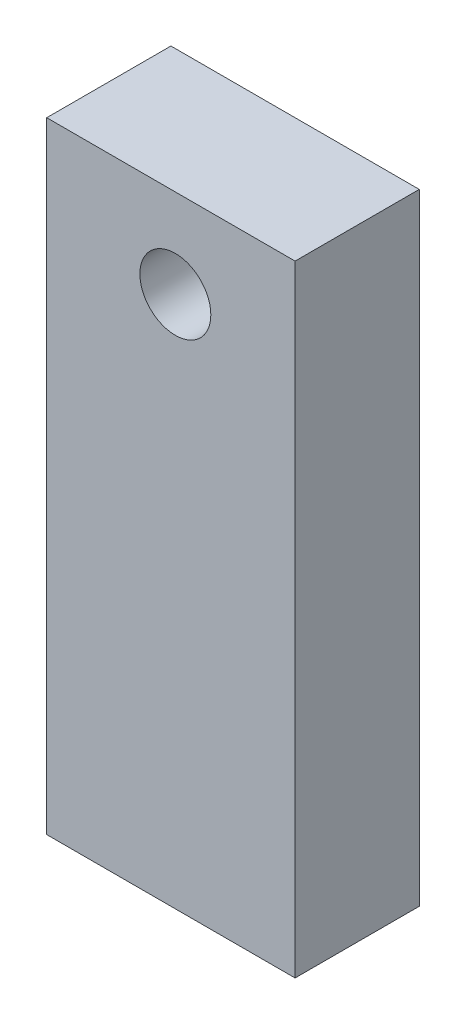
ISO-10303-21;
HEADER;
FILE_DESCRIPTION(('STEP AP214'),'2;1');
FILE_NAME('part.step','',(''),(''),'','','');
FILE_SCHEMA(('AUTOMOTIVE_DESIGN { 1 0 10303 214 1 1 1 1 }'));
ENDSEC;
DATA;
#1=APPLICATION_CONTEXT('core data for automotive mechanical design processes');
#2=APPLICATION_PROTOCOL_DEFINITION('international standard','automotive_design',2000,#1);
#3=PRODUCT_CONTEXT('',#1,'mechanical');
#4=PRODUCT('Part','Part','',(#3));
#5=PRODUCT_RELATED_PRODUCT_CATEGORY('part','',(#4));
#6=PRODUCT_DEFINITION_FORMATION('','',#4);
#7=PRODUCT_DEFINITION_CONTEXT('part definition',#1,'design');
#8=PRODUCT_DEFINITION('design','',#6,#7);
#9=PRODUCT_DEFINITION_SHAPE('','',#8);
#10=(LENGTH_UNIT() NAMED_UNIT(*) SI_UNIT(.MILLI.,.METRE.));
#11=(NAMED_UNIT(*) PLANE_ANGLE_UNIT() SI_UNIT($,.RADIAN.));
#12=(NAMED_UNIT(*) SI_UNIT($,.STERADIAN.) SOLID_ANGLE_UNIT());
#13=UNCERTAINTY_MEASURE_WITH_UNIT(LENGTH_MEASURE(1.E-05),#10,'distance_accuracy_value','');
#14=(GEOMETRIC_REPRESENTATION_CONTEXT(3) GLOBAL_UNCERTAINTY_ASSIGNED_CONTEXT((#13)) GLOBAL_UNIT_ASSIGNED_CONTEXT((#10,
#11,#12)) REPRESENTATION_CONTEXT('',''));
#15=CARTESIAN_POINT('',(0.,0.,0.));
#16=DIRECTION('',(0.,0.,1.));
#17=DIRECTION('',(1.,0.,0.));
#18=AXIS2_PLACEMENT_3D('',#15,#16,#17);
#19=CARTESIAN_POINT('',(0.,70.,0.));
#20=DIRECTION('',(1.,0.,0.));
#21=DIRECTION('',(0.,0.,-1.));
#22=AXIS2_PLACEMENT_3D('',#19,#20,#21);
#23=PLANE('',#22);
#24=DIRECTION('',(0.,0.,1.));
#25=VECTOR('',#24,1.);
#26=CARTESIAN_POINT('',(0.,0.,0.));
#27=LINE('',#26,#25);
#28=CARTESIAN_POINT('',(0.,0.,0.));
#29=VERTEX_POINT('',#28);
#30=CARTESIAN_POINT('',(0.,0.,14.));
#31=VERTEX_POINT('',#30);
#32=EDGE_CURVE('E94',#29,#31,#27,.T.);
#33=ORIENTED_EDGE('',*,*,#32,.T.);
#34=DIRECTION('',(0.,-1.,0.));
#35=VECTOR('',#34,1.);
#36=CARTESIAN_POINT('',(0.,70.,14.));
#37=LINE('',#36,#35);
#38=CARTESIAN_POINT('',(0.,70.,14.));
#39=VERTEX_POINT('',#38);
#40=EDGE_CURVE('E11',#39,#31,#37,.T.);
#41=ORIENTED_EDGE('',*,*,#40,.F.);
#42=DIRECTION('',(0.,0.,1.));
#43=VECTOR('',#42,1.);
#44=CARTESIAN_POINT('',(0.,70.,0.));
#45=LINE('',#44,#43);
#46=CARTESIAN_POINT('',(0.,70.,0.));
#47=VERTEX_POINT('',#46);
#48=EDGE_CURVE('E82',#47,#39,#45,.T.);
#49=ORIENTED_EDGE('',*,*,#48,.F.);
#50=DIRECTION('',(0.,-1.,0.));
#51=VECTOR('',#50,1.);
#52=CARTESIAN_POINT('',(0.,70.,0.));
#53=LINE('',#52,#51);
#54=EDGE_CURVE('E90',#47,#29,#53,.T.);
#55=ORIENTED_EDGE('',*,*,#54,.T.);
#56=EDGE_LOOP('',(#33,#41,#49,#55));
#57=FACE_BOUND('',#56,.T.);
#58=ADVANCED_FACE('F31',(#57),#23,.F.);
#59=CARTESIAN_POINT('',(0.,70.,14.));
#60=DIRECTION('',(0.,0.,-1.));
#61=DIRECTION('',(-1.,0.,0.));
#62=AXIS2_PLACEMENT_3D('',#59,#60,#61);
#63=PLANE('',#62);
#64=CARTESIAN_POINT('',(14.5,60.,14.));
#65=DIRECTION('',(0.,0.,1.));
#66=DIRECTION('',(1.,0.,0.));
#67=AXIS2_PLACEMENT_3D('',#64,#65,#66);
#68=CIRCLE('',#67,3.99999999999999);
#69=CARTESIAN_POINT('',(18.5,60.,14.));
#70=VERTEX_POINT('',#69);
#71=EDGE_CURVE('E108',#70,#70,#68,.T.);
#72=ORIENTED_EDGE('',*,*,#71,.F.);
#73=EDGE_LOOP('',(#72));
#74=FACE_BOUND('',#73,.T.);
#75=DIRECTION('',(1.,0.,0.));
#76=VECTOR('',#75,1.);
#77=CARTESIAN_POINT('',(0.,0.,14.));
#78=LINE('',#77,#76);
#79=CARTESIAN_POINT('',(28.,0.,14.));
#80=VERTEX_POINT('',#79);
#81=EDGE_CURVE('E86',#31,#80,#78,.T.);
#82=ORIENTED_EDGE('',*,*,#81,.T.);
#83=DIRECTION('',(0.,-1.,0.));
#84=VECTOR('',#83,1.);
#85=CARTESIAN_POINT('',(28.,70.,14.));
#86=LINE('',#85,#84);
#87=CARTESIAN_POINT('',(28.,70.,14.));
#88=VERTEX_POINT('',#87);
#89=EDGE_CURVE('E39',#88,#80,#86,.T.);
#90=ORIENTED_EDGE('',*,*,#89,.F.);
#91=DIRECTION('',(1.,0.,0.));
#92=VECTOR('',#91,1.);
#93=CARTESIAN_POINT('',(0.,70.,14.));
#94=LINE('',#93,#92);
#95=EDGE_CURVE('E77',#39,#88,#94,.T.);
#96=ORIENTED_EDGE('',*,*,#95,.F.);
#97=ORIENTED_EDGE('',*,*,#40,.T.);
#98=EDGE_LOOP('',(#82,#90,#96,#97));
#99=FACE_BOUND('',#98,.T.);
#100=ADVANCED_FACE('F85',(#74,#99),#63,.F.);
#101=CARTESIAN_POINT('',(28.,70.,0.));
#102=DIRECTION('',(-1.,0.,0.));
#103=DIRECTION('',(0.,0.,1.));
#104=AXIS2_PLACEMENT_3D('',#101,#102,#103);
#105=PLANE('',#104);
#106=DIRECTION('',(0.,0.,-1.));
#107=VECTOR('',#106,1.);
#108=CARTESIAN_POINT('',(28.,0.,0.));
#109=LINE('',#108,#107);
#110=CARTESIAN_POINT('',(28.,0.,0.));
#111=VERTEX_POINT('',#110);
#112=EDGE_CURVE('E64',#80,#111,#109,.T.);
#113=ORIENTED_EDGE('',*,*,#112,.T.);
#114=DIRECTION('',(0.,-1.,0.));
#115=VECTOR('',#114,1.);
#116=CARTESIAN_POINT('',(28.,70.,0.));
#117=LINE('',#116,#115);
#118=CARTESIAN_POINT('',(28.,70.,0.));
#119=VERTEX_POINT('',#118);
#120=EDGE_CURVE('E87',#119,#111,#117,.T.);
#121=ORIENTED_EDGE('',*,*,#120,.F.);
#122=DIRECTION('',(0.,0.,-1.));
#123=VECTOR('',#122,1.);
#124=CARTESIAN_POINT('',(28.,70.,0.));
#125=LINE('',#124,#123);
#126=EDGE_CURVE('E80',#88,#119,#125,.T.);
#127=ORIENTED_EDGE('',*,*,#126,.F.);
#128=ORIENTED_EDGE('',*,*,#89,.T.);
#129=EDGE_LOOP('',(#113,#121,#127,#128));
#130=FACE_BOUND('',#129,.T.);
#131=ADVANCED_FACE('F88',(#130),#105,.F.);
#132=CARTESIAN_POINT('',(0.,70.,0.));
#133=DIRECTION('',(0.,0.,1.));
#134=DIRECTION('',(1.,0.,0.));
#135=AXIS2_PLACEMENT_3D('',#132,#133,#134);
#136=PLANE('',#135);
#137=CARTESIAN_POINT('',(14.5,60.,0.));
#138=DIRECTION('',(0.,0.,1.));
#139=DIRECTION('',(1.,0.,0.));
#140=AXIS2_PLACEMENT_3D('',#137,#138,#139);
#141=CIRCLE('',#140,3.99999999999999);
#142=CARTESIAN_POINT('',(18.5,60.,0.));
#143=VERTEX_POINT('',#142);
#144=EDGE_CURVE('E97',#143,#143,#141,.T.);
#145=ORIENTED_EDGE('',*,*,#144,.T.);
#146=EDGE_LOOP('',(#145));
#147=FACE_BOUND('',#146,.T.);
#148=DIRECTION('',(-1.,0.,0.));
#149=VECTOR('',#148,1.);
#150=CARTESIAN_POINT('',(0.,0.,0.));
#151=LINE('',#150,#149);
#152=EDGE_CURVE('E70',#111,#29,#151,.T.);
#153=ORIENTED_EDGE('',*,*,#152,.T.);
#154=ORIENTED_EDGE('',*,*,#54,.F.);
#155=DIRECTION('',(-1.,0.,0.));
#156=VECTOR('',#155,1.);
#157=CARTESIAN_POINT('',(0.,70.,0.));
#158=LINE('',#157,#156);
#159=EDGE_CURVE('E47',#119,#47,#158,.T.);
#160=ORIENTED_EDGE('',*,*,#159,.F.);
#161=ORIENTED_EDGE('',*,*,#120,.T.);
#162=EDGE_LOOP('',(#153,#154,#160,#161));
#163=FACE_BOUND('',#162,.T.);
#164=ADVANCED_FACE('F102',(#147,#163),#136,.F.);
#165=CARTESIAN_POINT('',(0.,70.,14.));
#166=DIRECTION('',(0.,1.,0.));
#167=DIRECTION('',(0.,0.,1.));
#168=AXIS2_PLACEMENT_3D('',#165,#166,#167);
#169=PLANE('',#168);
#170=ORIENTED_EDGE('',*,*,#48,.T.);
#171=ORIENTED_EDGE('',*,*,#95,.T.);
#172=ORIENTED_EDGE('',*,*,#126,.T.);
#173=ORIENTED_EDGE('',*,*,#159,.T.);
#174=EDGE_LOOP('',(#170,#171,#172,#173));
#175=FACE_BOUND('',#174,.T.);
#176=ADVANCED_FACE('F78',(#175),#169,.T.);
#177=CARTESIAN_POINT('',(0.,0.,14.));
#178=DIRECTION('',(0.,1.,0.));
#179=DIRECTION('',(0.,0.,1.));
#180=AXIS2_PLACEMENT_3D('',#177,#178,#179);
#181=PLANE('',#180);
#182=ORIENTED_EDGE('',*,*,#32,.F.);
#183=ORIENTED_EDGE('',*,*,#152,.F.);
#184=ORIENTED_EDGE('',*,*,#112,.F.);
#185=ORIENTED_EDGE('',*,*,#81,.F.);
#186=EDGE_LOOP('',(#182,#183,#184,#185));
#187=FACE_BOUND('',#186,.T.);
#188=ADVANCED_FACE('F105',(#187),#181,.F.);
#189=CARTESIAN_POINT('',(14.5,60.,0.));
#190=DIRECTION('',(0.,0.,1.));
#191=DIRECTION('',(1.,0.,0.));
#192=AXIS2_PLACEMENT_3D('',#189,#190,#191);
#193=CYLINDRICAL_SURFACE('',#192,3.99999999999999);
#194=ORIENTED_EDGE('',*,*,#144,.F.);
#195=EDGE_LOOP('',(#194));
#196=FACE_BOUND('',#195,.T.);
#197=ORIENTED_EDGE('',*,*,#71,.T.);
#198=EDGE_LOOP('',(#197));
#199=FACE_BOUND('',#198,.T.);
#200=ADVANCED_FACE('F115',(#196,#199),#193,.F.);
#201=CLOSED_SHELL('',(#58,#100,#131,#164,#176,#188,#200));
#202=MANIFOLD_SOLID_BREP('B2',#201);
#203=ADVANCED_BREP_SHAPE_REPRESENTATION('',(#18,#202),#14);
#204=SHAPE_DEFINITION_REPRESENTATION(#9,#203);
ENDSEC;
END-ISO-10303-21;
